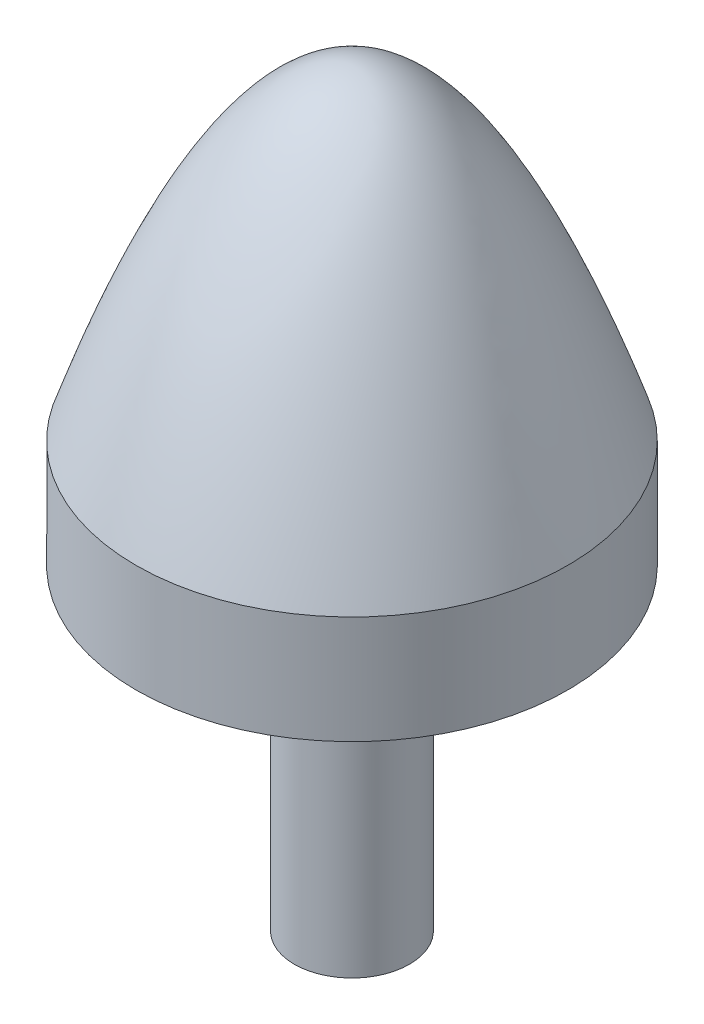
ISO-10303-21;
HEADER;
FILE_DESCRIPTION(('STEP AP214'),'2;1');
FILE_NAME('part.step','',(''),(''),'','','');
FILE_SCHEMA(('AUTOMOTIVE_DESIGN { 1 0 10303 214 1 1 1 1 }'));
ENDSEC;
DATA;
#1=APPLICATION_CONTEXT('core data for automotive mechanical design processes');
#2=APPLICATION_PROTOCOL_DEFINITION('international standard','automotive_design',2000,#1);
#3=PRODUCT_CONTEXT('',#1,'mechanical');
#4=PRODUCT('Part','Part','',(#3));
#5=PRODUCT_RELATED_PRODUCT_CATEGORY('part','',(#4));
#6=PRODUCT_DEFINITION_FORMATION('','',#4);
#7=PRODUCT_DEFINITION_CONTEXT('part definition',#1,'design');
#8=PRODUCT_DEFINITION('design','',#6,#7);
#9=PRODUCT_DEFINITION_SHAPE('','',#8);
#10=(LENGTH_UNIT() NAMED_UNIT(*) SI_UNIT(.MILLI.,.METRE.));
#11=(NAMED_UNIT(*) PLANE_ANGLE_UNIT() SI_UNIT($,.RADIAN.));
#12=(NAMED_UNIT(*) SI_UNIT($,.STERADIAN.) SOLID_ANGLE_UNIT());
#13=UNCERTAINTY_MEASURE_WITH_UNIT(LENGTH_MEASURE(1.E-05),#10,'distance_accuracy_value','');
#14=(GEOMETRIC_REPRESENTATION_CONTEXT(3) GLOBAL_UNCERTAINTY_ASSIGNED_CONTEXT((#13)) GLOBAL_UNIT_ASSIGNED_CONTEXT((#10,
#11,#12)) REPRESENTATION_CONTEXT('',''));
#15=CARTESIAN_POINT('',(0.,0.,0.));
#16=DIRECTION('',(0.,0.,1.));
#17=DIRECTION('',(1.,0.,0.));
#18=AXIS2_PLACEMENT_3D('',#15,#16,#17);
#19=CARTESIAN_POINT('',(0.,30.,0.));
#20=DIRECTION('',(0.,1.,0.));
#21=DIRECTION('',(0.,0.,1.));
#22=AXIS2_PLACEMENT_3D('',#19,#20,#21);
#23=CYLINDRICAL_SURFACE('',#22,4.);
#24=CARTESIAN_POINT('',(0.,0.,0.));
#25=DIRECTION('',(0.,1.,0.));
#26=DIRECTION('',(0.,0.,1.));
#27=AXIS2_PLACEMENT_3D('',#24,#25,#26);
#28=CIRCLE('',#27,4.);
#29=CARTESIAN_POINT('',(0.,0.,4.));
#30=VERTEX_POINT('',#29);
#31=EDGE_CURVE('E77',#30,#30,#28,.T.);
#32=ORIENTED_EDGE('',*,*,#31,.F.);
#33=EDGE_LOOP('',(#32));
#34=FACE_BOUND('',#33,.T.);
#35=CARTESIAN_POINT('',(0.,-22.,0.));
#36=DIRECTION('',(0.,-1.,0.));
#37=DIRECTION('',(1.,0.,0.));
#38=AXIS2_PLACEMENT_3D('',#35,#36,#37);
#39=CIRCLE('',#38,4.);
#40=CARTESIAN_POINT('',(4.,-22.,0.));
#41=VERTEX_POINT('',#40);
#42=EDGE_CURVE('E42',#41,#41,#39,.F.);
#43=ORIENTED_EDGE('',*,*,#42,.T.);
#44=EDGE_LOOP('',(#43));
#45=FACE_BOUND('',#44,.T.);
#46=ADVANCED_FACE('F37',(#34,#45),#23,.T.);
#47=CARTESIAN_POINT('',(0.,30.,0.));
#48=CARTESIAN_POINT('',(-7.49999999999969,30.,0.));
#49=CARTESIAN_POINT('',(-14.9999999999994,7.50000000000241,0.));
#50=B_SPLINE_CURVE_WITH_KNOTS('',2,(#47,#48,#49),.UNSPECIFIED.,.F.,.F.,(3,3),
(0.0502632428870729,0.913660294807913),.UNSPECIFIED.);
#51=CARTESIAN_POINT('',(0.,30.,0.));
#52=DIRECTION('',(0.,1.,0.));
#53=AXIS1_PLACEMENT('',#51,#52);
#54=SURFACE_OF_REVOLUTION('',#50,#53);
#55=CARTESIAN_POINT('',(0.,7.50000000000218,0.));
#56=DIRECTION('',(0.,1.,0.));
#57=DIRECTION('',(0.,0.,1.));
#58=AXIS2_PLACEMENT_3D('',#55,#56,#57);
#59=CIRCLE('',#58,15.);
#60=CARTESIAN_POINT('',(0.,7.50000000000218,15.));
#61=VERTEX_POINT('',#60);
#62=EDGE_CURVE('E11',#61,#61,#59,.T.);
#63=ORIENTED_EDGE('',*,*,#62,.T.);
#64=EDGE_LOOP('',(#63));
#65=FACE_BOUND('',#64,.T.);
#66=CARTESIAN_POINT('',(0.,30.,0.));
#67=VERTEX_POINT('',#66);
#68=VERTEX_LOOP('',#67);
#69=FACE_BOUND('',#68,.T.);
#70=ADVANCED_FACE('F39',(#65,#69),#54,.F.);
#71=CARTESIAN_POINT('',(0.,30.,0.));
#72=DIRECTION('',(0.,1.,0.));
#73=DIRECTION('',(0.,0.,1.));
#74=AXIS2_PLACEMENT_3D('',#71,#72,#73);
#75=CYLINDRICAL_SURFACE('',#74,15.);
#76=CARTESIAN_POINT('',(0.,0.,0.));
#77=DIRECTION('',(0.,1.,0.));
#78=DIRECTION('',(0.,0.,1.));
#79=AXIS2_PLACEMENT_3D('',#76,#77,#78);
#80=CIRCLE('',#79,15.);
#81=CARTESIAN_POINT('',(0.,0.,15.));
#82=VERTEX_POINT('',#81);
#83=EDGE_CURVE('E46',#82,#82,#80,.T.);
#84=ORIENTED_EDGE('',*,*,#83,.T.);
#85=EDGE_LOOP('',(#84));
#86=FACE_BOUND('',#85,.T.);
#87=ORIENTED_EDGE('',*,*,#62,.F.);
#88=EDGE_LOOP('',(#87));
#89=FACE_BOUND('',#88,.T.);
#90=ADVANCED_FACE('F50',(#86,#89),#75,.T.);
#91=CARTESIAN_POINT('',(-4.,0.,0.));
#92=DIRECTION('',(0.,-1.,0.));
#93=DIRECTION('',(0.,0.,-1.));
#94=AXIS2_PLACEMENT_3D('',#91,#92,#93);
#95=PLANE('',#94);
#96=ORIENTED_EDGE('',*,*,#31,.T.);
#97=EDGE_LOOP('',(#96));
#98=FACE_BOUND('',#97,.T.);
#99=ORIENTED_EDGE('',*,*,#83,.F.);
#100=EDGE_LOOP('',(#99));
#101=FACE_BOUND('',#100,.T.);
#102=ADVANCED_FACE('F56',(#98,#101),#95,.T.);
#103=CARTESIAN_POINT('',(0.,-22.,0.));
#104=DIRECTION('',(0.,-1.,0.));
#105=DIRECTION('',(1.,0.,0.));
#106=AXIS2_PLACEMENT_3D('',#103,#104,#105);
#107=PLANE('',#106);
#108=ORIENTED_EDGE('',*,*,#42,.F.);
#109=EDGE_LOOP('',(#108));
#110=FACE_BOUND('',#109,.T.);
#111=ADVANCED_FACE('F68',(#110),#107,.T.);
#112=CLOSED_SHELL('',(#46,#70,#90,#102,#111));
#113=MANIFOLD_SOLID_BREP('B2',#112);
#114=ADVANCED_BREP_SHAPE_REPRESENTATION('',(#18,#113),#14);
#115=SHAPE_DEFINITION_REPRESENTATION(#9,#114);
ENDSEC;
END-ISO-10303-21;
